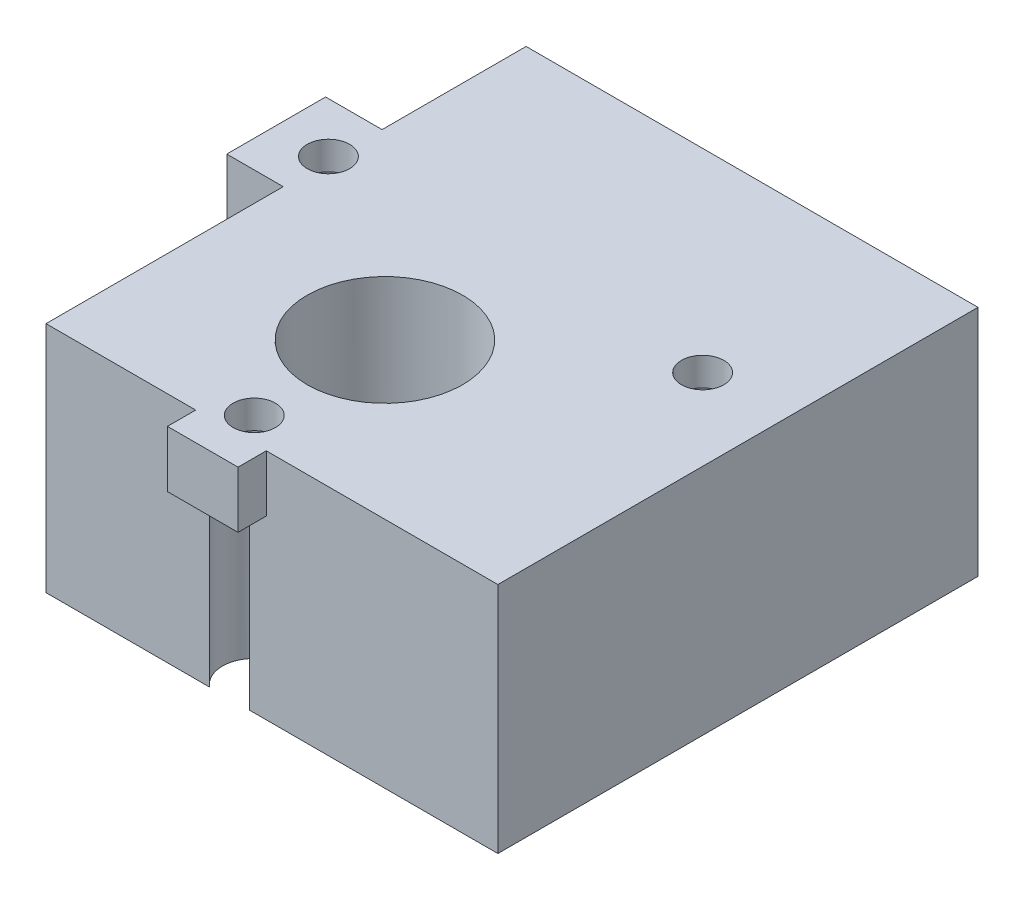
ISO-10303-21;
HEADER;
FILE_DESCRIPTION(('STEP AP214'),'2;1');
FILE_NAME('part.step','',(''),(''),'','','');
FILE_SCHEMA(('AUTOMOTIVE_DESIGN { 1 0 10303 214 1 1 1 1 }'));
ENDSEC;
DATA;
#1=APPLICATION_CONTEXT('core data for automotive mechanical design processes');
#2=APPLICATION_PROTOCOL_DEFINITION('international standard','automotive_design',2000,#1);
#3=PRODUCT_CONTEXT('',#1,'mechanical');
#4=PRODUCT('Part','Part','',(#3));
#5=PRODUCT_RELATED_PRODUCT_CATEGORY('part','',(#4));
#6=PRODUCT_DEFINITION_FORMATION('','',#4);
#7=PRODUCT_DEFINITION_CONTEXT('part definition',#1,'design');
#8=PRODUCT_DEFINITION('design','',#6,#7);
#9=PRODUCT_DEFINITION_SHAPE('','',#8);
#10=(LENGTH_UNIT() NAMED_UNIT(*) SI_UNIT(.MILLI.,.METRE.));
#11=(NAMED_UNIT(*) PLANE_ANGLE_UNIT() SI_UNIT($,.RADIAN.));
#12=(NAMED_UNIT(*) SI_UNIT($,.STERADIAN.) SOLID_ANGLE_UNIT());
#13=UNCERTAINTY_MEASURE_WITH_UNIT(LENGTH_MEASURE(1.E-05),#10,'distance_accuracy_value','');
#14=(GEOMETRIC_REPRESENTATION_CONTEXT(3) GLOBAL_UNCERTAINTY_ASSIGNED_CONTEXT((#13)) GLOBAL_UNIT_ASSIGNED_CONTEXT((#10,
#11,#12)) REPRESENTATION_CONTEXT('',''));
#15=CARTESIAN_POINT('',(0.,0.,0.));
#16=DIRECTION('',(0.,0.,1.));
#17=DIRECTION('',(1.,0.,0.));
#18=AXIS2_PLACEMENT_3D('',#15,#16,#17);
#19=CARTESIAN_POINT('',(-13.,13.5,-23.));
#20=DIRECTION('',(1.,0.,0.));
#21=DIRECTION('',(0.,0.,-1.));
#22=AXIS2_PLACEMENT_3D('',#19,#20,#21);
#23=PLANE('',#22);
#24=DIRECTION('',(0.,-1.,0.));
#25=VECTOR('',#24,1.);
#26=CARTESIAN_POINT('',(-13.,19.8639610306789,-11.4860679774998));
#27=LINE('',#26,#25);
#28=CARTESIAN_POINT('',(-13.,9.5,-11.4860679774998));
#29=VERTEX_POINT('',#28);
#30=CARTESIAN_POINT('',(-13.,-3.,-11.4860679774998));
#31=VERTEX_POINT('',#30);
#32=EDGE_CURVE('E519',#29,#31,#27,.T.);
#33=ORIENTED_EDGE('',*,*,#32,.F.);
#34=DIRECTION('',(0.,0.,-1.));
#35=VECTOR('',#34,1.);
#36=CARTESIAN_POINT('',(-13.,9.5,-5.8));
#37=LINE('',#36,#35);
#38=CARTESIAN_POINT('',(-13.,9.5,-12.8));
#39=VERTEX_POINT('',#38);
#40=EDGE_CURVE('E480',#29,#39,#37,.T.);
#41=ORIENTED_EDGE('',*,*,#40,.T.);
#42=DIRECTION('',(0.,1.,0.));
#43=VECTOR('',#42,1.);
#44=CARTESIAN_POINT('',(-13.,9.5,-12.8));
#45=LINE('',#44,#43);
#46=CARTESIAN_POINT('',(-13.,13.5,-12.8));
#47=VERTEX_POINT('',#46);
#48=EDGE_CURVE('E488',#39,#47,#45,.T.);
#49=ORIENTED_EDGE('',*,*,#48,.T.);
#50=DIRECTION('',(0.,0.,1.));
#51=VECTOR('',#50,1.);
#52=CARTESIAN_POINT('',(-13.,13.5,-23.));
#53=LINE('',#52,#51);
#54=CARTESIAN_POINT('',(-13.,13.5,-23.));
#55=VERTEX_POINT('',#54);
#56=EDGE_CURVE('E379',#55,#47,#53,.T.);
#57=ORIENTED_EDGE('',*,*,#56,.F.);
#58=DIRECTION('',(0.,-1.,0.));
#59=VECTOR('',#58,1.);
#60=CARTESIAN_POINT('',(-13.,13.5,-23.));
#61=LINE('',#60,#59);
#62=CARTESIAN_POINT('',(-13.,-3.,-23.));
#63=VERTEX_POINT('',#62);
#64=EDGE_CURVE('E392',#55,#63,#61,.T.);
#65=ORIENTED_EDGE('',*,*,#64,.T.);
#66=DIRECTION('',(0.,0.,1.));
#67=VECTOR('',#66,1.);
#68=CARTESIAN_POINT('',(-13.,-3.,-23.));
#69=LINE('',#68,#67);
#70=EDGE_CURVE('E344',#63,#31,#69,.T.);
#71=ORIENTED_EDGE('',*,*,#70,.T.);
#72=EDGE_LOOP('',(#33,#41,#49,#57,#65,#71));
#73=FACE_BOUND('',#72,.T.);
#74=ADVANCED_FACE('F169',(#73),#23,.F.);
#75=DIRECTION('',(0.,-1.,0.));
#76=VECTOR('',#75,1.);
#77=CARTESIAN_POINT('',(-13.,19.8639610306789,-7.01393202250021));
#78=LINE('',#77,#76);
#79=CARTESIAN_POINT('',(-13.,-3.,-7.01393202250021));
#80=VERTEX_POINT('',#79);
#81=CARTESIAN_POINT('',(-13.,9.5,-7.01393202250021));
#82=VERTEX_POINT('',#81);
#83=EDGE_CURVE('E190',#80,#82,#78,.F.);
#84=ORIENTED_EDGE('',*,*,#83,.F.);
#85=CARTESIAN_POINT('',(-13.,-3.,11.));
#86=VERTEX_POINT('',#85);
#87=EDGE_CURVE('E347',#80,#86,#69,.T.);
#88=ORIENTED_EDGE('',*,*,#87,.T.);
#89=DIRECTION('',(0.,-1.,0.));
#90=VECTOR('',#89,1.);
#91=CARTESIAN_POINT('',(-13.,13.5,11.));
#92=LINE('',#91,#90);
#93=CARTESIAN_POINT('',(-13.,13.5,11.));
#94=VERTEX_POINT('',#93);
#95=EDGE_CURVE('E398',#94,#86,#92,.T.);
#96=ORIENTED_EDGE('',*,*,#95,.F.);
#97=CARTESIAN_POINT('',(-13.,13.5,-5.8));
#98=VERTEX_POINT('',#97);
#99=EDGE_CURVE('E378',#98,#94,#53,.T.);
#100=ORIENTED_EDGE('',*,*,#99,.F.);
#101=DIRECTION('',(0.,1.,0.));
#102=VECTOR('',#101,1.);
#103=CARTESIAN_POINT('',(-13.,9.5,-5.8));
#104=LINE('',#103,#102);
#105=CARTESIAN_POINT('',(-13.,9.5,-5.8));
#106=VERTEX_POINT('',#105);
#107=EDGE_CURVE('E495',#106,#98,#104,.T.);
#108=ORIENTED_EDGE('',*,*,#107,.F.);
#109=EDGE_CURVE('E476',#106,#82,#37,.T.);
#110=ORIENTED_EDGE('',*,*,#109,.T.);
#111=EDGE_LOOP('',(#84,#88,#96,#100,#108,#110));
#112=FACE_BOUND('',#111,.T.);
#113=ADVANCED_FACE('F591',(#112),#23,.F.);
#114=CARTESIAN_POINT('',(-13.,13.5,11.));
#115=DIRECTION('',(0.,0.,-1.));
#116=DIRECTION('',(-1.,0.,0.));
#117=AXIS2_PLACEMENT_3D('',#114,#115,#116);
#118=PLANE('',#117);
#119=DIRECTION('',(0.,-1.,0.));
#120=VECTOR('',#119,1.);
#121=CARTESIAN_POINT('',(1.4142135623731,19.8639610306789,11.));
#122=LINE('',#121,#120);
#123=CARTESIAN_POINT('',(1.4142135623731,-3.,11.));
#124=VERTEX_POINT('',#123);
#125=CARTESIAN_POINT('',(1.4142135623731,9.5,11.));
#126=VERTEX_POINT('',#125);
#127=EDGE_CURVE('E183',#124,#126,#122,.F.);
#128=ORIENTED_EDGE('',*,*,#127,.F.);
#129=DIRECTION('',(1.,0.,0.));
#130=VECTOR('',#129,1.);
#131=CARTESIAN_POINT('',(-13.,-3.,11.));
#132=LINE('',#131,#130);
#133=CARTESIAN_POINT('',(19.,-3.,11.));
#134=VERTEX_POINT('',#133);
#135=EDGE_CURVE('E329',#124,#134,#132,.T.);
#136=ORIENTED_EDGE('',*,*,#135,.T.);
#137=DIRECTION('',(0.,-1.,0.));
#138=VECTOR('',#137,1.);
#139=CARTESIAN_POINT('',(19.,13.5,11.));
#140=LINE('',#139,#138);
#141=CARTESIAN_POINT('',(19.,13.5,11.));
#142=VERTEX_POINT('',#141);
#143=EDGE_CURVE('E396',#142,#134,#140,.T.);
#144=ORIENTED_EDGE('',*,*,#143,.F.);
#145=DIRECTION('',(1.,0.,0.));
#146=VECTOR('',#145,1.);
#147=CARTESIAN_POINT('',(-13.,13.5,11.));
#148=LINE('',#147,#146);
#149=CARTESIAN_POINT('',(2.60000000000028,13.5,11.));
#150=VERTEX_POINT('',#149);
#151=EDGE_CURVE('E382',#150,#142,#148,.T.);
#152=ORIENTED_EDGE('',*,*,#151,.F.);
#153=DIRECTION('',(0.,1.,0.));
#154=VECTOR('',#153,1.);
#155=CARTESIAN_POINT('',(2.60000000000028,9.5,11.));
#156=LINE('',#155,#154);
#157=CARTESIAN_POINT('',(2.60000000000028,9.5,11.));
#158=VERTEX_POINT('',#157);
#159=EDGE_CURVE('E454',#158,#150,#156,.T.);
#160=ORIENTED_EDGE('',*,*,#159,.F.);
#161=DIRECTION('',(-1.,0.,0.));
#162=VECTOR('',#161,1.);
#163=CARTESIAN_POINT('',(2.60000000000028,9.5,11.));
#164=LINE('',#163,#162);
#165=EDGE_CURVE('E333',#158,#126,#164,.T.);
#166=ORIENTED_EDGE('',*,*,#165,.T.);
#167=EDGE_LOOP('',(#128,#136,#144,#152,#160,#166));
#168=FACE_BOUND('',#167,.T.);
#169=ADVANCED_FACE('F327',(#168),#118,.F.);
#170=DIRECTION('',(0.,-1.,0.));
#171=VECTOR('',#170,1.);
#172=CARTESIAN_POINT('',(-1.41421356237308,19.8639610306789,11.));
#173=LINE('',#172,#171);
#174=CARTESIAN_POINT('',(-1.41421356237308,9.5,11.));
#175=VERTEX_POINT('',#174);
#176=CARTESIAN_POINT('',(-1.41421356237308,-3.,11.));
#177=VERTEX_POINT('',#176);
#178=EDGE_CURVE('E317',#175,#177,#173,.T.);
#179=ORIENTED_EDGE('',*,*,#178,.F.);
#180=CARTESIAN_POINT('',(-2.39999999999972,9.5,11.));
#181=VERTEX_POINT('',#180);
#182=EDGE_CURVE('E468',#175,#181,#164,.T.);
#183=ORIENTED_EDGE('',*,*,#182,.T.);
#184=DIRECTION('',(0.,1.,0.));
#185=VECTOR('',#184,1.);
#186=CARTESIAN_POINT('',(-2.39999999999972,9.5,11.));
#187=LINE('',#186,#185);
#188=CARTESIAN_POINT('',(-2.39999999999972,13.5,11.));
#189=VERTEX_POINT('',#188);
#190=EDGE_CURVE('E451',#181,#189,#187,.T.);
#191=ORIENTED_EDGE('',*,*,#190,.T.);
#192=EDGE_CURVE('E383',#94,#189,#148,.T.);
#193=ORIENTED_EDGE('',*,*,#192,.F.);
#194=ORIENTED_EDGE('',*,*,#95,.T.);
#195=EDGE_CURVE('E343',#86,#177,#132,.T.);
#196=ORIENTED_EDGE('',*,*,#195,.T.);
#197=EDGE_LOOP('',(#179,#183,#191,#193,#194,#196));
#198=FACE_BOUND('',#197,.T.);
#199=ADVANCED_FACE('F668',(#198),#118,.F.);
#200=CARTESIAN_POINT('',(-3.48913043478261,-3.,-11.4815490596467));
#201=DIRECTION('',(0.,1.,0.));
#202=DIRECTION('',(0.,0.,1.));
#203=AXIS2_PLACEMENT_3D('',#200,#201,#202);
#204=CYLINDRICAL_SURFACE('',#203,8.5);
#205=DIRECTION('',(0.,-1.,0.));
#206=VECTOR('',#205,1.);
#207=CARTESIAN_POINT('',(-11.2996587041269,4.25,-8.12809589107955));
#208=LINE('',#207,#206);
#209=CARTESIAN_POINT('',(-11.2996587041269,0.,-8.12809589107955));
#210=VERTEX_POINT('',#209);
#211=CARTESIAN_POINT('',(-11.2996587041269,-3.,-8.12809589107955));
#212=VERTEX_POINT('',#211);
#213=EDGE_CURVE('E513',#210,#212,#208,.T.);
#214=ORIENTED_EDGE('',*,*,#213,.F.);
#215=CARTESIAN_POINT('',(-3.48913043478261,0.,-11.4815490596467));
#216=DIRECTION('',(0.,1.,0.));
#217=DIRECTION('',(0.,0.,1.));
#218=AXIS2_PLACEMENT_3D('',#215,#216,#217);
#219=CIRCLE('',#218,8.5);
#220=CARTESIAN_POINT('',(-4.57596509446919,0.,-3.05131831413895));
#221=VERTEX_POINT('',#220);
#222=EDGE_CURVE('E425',#210,#221,#219,.T.);
#223=ORIENTED_EDGE('',*,*,#222,.T.);
#224=DIRECTION('',(0.,1.,0.));
#225=VECTOR('',#224,1.);
#226=CARTESIAN_POINT('',(-4.57596509446919,-1.5,-3.05131831413895));
#227=LINE('',#226,#225);
#228=CARTESIAN_POINT('',(-4.57596509446919,-3.,-3.05131831413895));
#229=VERTEX_POINT('',#228);
#230=EDGE_CURVE('E354',#221,#229,#227,.F.);
#231=ORIENTED_EDGE('',*,*,#230,.T.);
#232=CARTESIAN_POINT('',(-3.48913043478261,-3.,-11.4815490596467));
#233=DIRECTION('',(0.,1.,0.));
#234=DIRECTION('',(0.,0.,1.));
#235=AXIS2_PLACEMENT_3D('',#232,#233,#234);
#236=CIRCLE('',#235,8.5);
#237=EDGE_CURVE('E422',#212,#229,#236,.T.);
#238=ORIENTED_EDGE('',*,*,#237,.F.);
#239=EDGE_LOOP('',(#214,#223,#231,#238));
#240=FACE_BOUND('',#239,.T.);
#241=ADVANCED_FACE('F632',(#240),#204,.F.);
#242=DIRECTION('',(0.,-1.,0.));
#243=VECTOR('',#242,1.);
#244=CARTESIAN_POINT('',(-11.9809154609284,4.25,-11.1079355297453));
#245=LINE('',#244,#243);
#246=CARTESIAN_POINT('',(-11.9809154609284,-3.,-11.1079355297453));
#247=VERTEX_POINT('',#246);
#248=CARTESIAN_POINT('',(-11.9809154609284,0.,-11.1079355297453));
#249=VERTEX_POINT('',#248);
#250=EDGE_CURVE('E517',#247,#249,#245,.F.);
#251=ORIENTED_EDGE('',*,*,#250,.F.);
#252=CARTESIAN_POINT('',(2.10449770316484,-3.,-5.0814456031108));
#253=VERTEX_POINT('',#252);
#254=EDGE_CURVE('E420',#253,#247,#236,.T.);
#255=ORIENTED_EDGE('',*,*,#254,.F.);
#256=DIRECTION('',(0.,1.,0.));
#257=VECTOR('',#256,1.);
#258=CARTESIAN_POINT('',(2.10449770316484,-1.5,-5.08144560311081));
#259=LINE('',#258,#257);
#260=CARTESIAN_POINT('',(2.10449770316484,0.,-5.0814456031108));
#261=VERTEX_POINT('',#260);
#262=EDGE_CURVE('E357',#253,#261,#259,.T.);
#263=ORIENTED_EDGE('',*,*,#262,.T.);
#264=EDGE_CURVE('E423',#261,#249,#219,.T.);
#265=ORIENTED_EDGE('',*,*,#264,.T.);
#266=EDGE_LOOP('',(#251,#255,#263,#265));
#267=FACE_BOUND('',#266,.T.);
#268=ADVANCED_FACE('F620',(#267),#204,.F.);
#269=CARTESIAN_POINT('',(0.,0.,0.));
#270=DIRECTION('',(0.,1.,0.));
#271=DIRECTION('',(0.,0.,1.));
#272=AXIS2_PLACEMENT_3D('',#269,#270,#271);
#273=PLANE('',#272);
#274=CARTESIAN_POINT('',(4.98501881873766,0.,-0.386765273559278));
#275=DIRECTION('',(0.,1.,0.));
#276=DIRECTION('',(0.,0.,1.));
#277=AXIS2_PLACEMENT_3D('',#274,#275,#276);
#278=CIRCLE('',#277,1.2);
#279=CARTESIAN_POINT('',(5.45289806149909,0.,0.718263691759281));
#280=VERTEX_POINT('',#279);
#281=CARTESIAN_POINT('',(5.27685644395189,0.,-1.55073726656827));
#282=VERTEX_POINT('',#281);
#283=EDGE_CURVE('E442',#280,#282,#278,.T.);
#284=ORIENTED_EDGE('',*,*,#283,.F.);
#285=CARTESIAN_POINT('',(0.,0.,0.));
#286=DIRECTION('',(0.,1.,0.));
#287=DIRECTION('',(0.,0.,1.));
#288=AXIS2_PLACEMENT_3D('',#285,#286,#287);
#289=CIRCLE('',#288,5.50000000000002);
#290=EDGE_CURVE('E374',#280,#282,#289,.T.);
#291=ORIENTED_EDGE('',*,*,#290,.T.);
#292=EDGE_LOOP('',(#284,#291));
#293=FACE_BOUND('',#292,.T.);
#294=ADVANCED_FACE('F638',(#293),#273,.F.);
#295=CARTESIAN_POINT('',(-13.2499999999999,0.,-9.25000000000001));
#296=DIRECTION('',(0.,1.,0.));
#297=DIRECTION('',(0.,0.,1.));
#298=AXIS2_PLACEMENT_3D('',#295,#296,#297);
#299=CIRCLE('',#298,2.25);
#300=EDGE_CURVE('E515',#249,#210,#299,.F.);
#301=ORIENTED_EDGE('',*,*,#300,.F.);
#302=ORIENTED_EDGE('',*,*,#264,.F.);
#303=EDGE_CURVE('E369',#261,#221,#289,.T.);
#304=ORIENTED_EDGE('',*,*,#303,.T.);
#305=ORIENTED_EDGE('',*,*,#222,.F.);
#306=EDGE_LOOP('',(#301,#302,#304,#305));
#307=FACE_BOUND('',#306,.T.);
#308=CARTESIAN_POINT('',(-3.48913043478261,0.,-11.4815490596467));
#309=DIRECTION('',(0.,1.,0.));
#310=DIRECTION('',(0.,0.,1.));
#311=AXIS2_PLACEMENT_3D('',#308,#309,#310);
#312=CIRCLE('',#311,1.2);
#313=CARTESIAN_POINT('',(-3.48913043478261,0.,-10.2815490596467));
#314=VERTEX_POINT('',#313);
#315=EDGE_CURVE('E373',#314,#314,#312,.T.);
#316=ORIENTED_EDGE('',*,*,#315,.T.);
#317=EDGE_LOOP('',(#316));
#318=FACE_BOUND('',#317,.T.);
#319=ADVANCED_FACE('F629',(#307,#318),#273,.F.);
#320=CARTESIAN_POINT('',(-3.48913043478261,13.5,-11.4815490596467));
#321=DIRECTION('',(0.,-1.,0.));
#322=DIRECTION('',(0.,0.,-1.));
#323=AXIS2_PLACEMENT_3D('',#320,#321,#322);
#324=CYLINDRICAL_SURFACE('',#323,1.2);
#325=ORIENTED_EDGE('',*,*,#315,.F.);
#326=EDGE_LOOP('',(#325));
#327=FACE_BOUND('',#326,.T.);
#328=CARTESIAN_POINT('',(-3.48913043478261,3.,-11.4815490596467));
#329=DIRECTION('',(0.,1.,0.));
#330=DIRECTION('',(0.,0.,1.));
#331=AXIS2_PLACEMENT_3D('',#328,#329,#330);
#332=CIRCLE('',#331,1.2);
#333=CARTESIAN_POINT('',(-3.48913043478261,3.,-10.2815490596467));
#334=VERTEX_POINT('',#333);
#335=EDGE_CURVE('E366',#334,#334,#332,.F.);
#336=ORIENTED_EDGE('',*,*,#335,.F.);
#337=EDGE_LOOP('',(#336));
#338=FACE_BOUND('',#337,.T.);
#339=ADVANCED_FACE('F646',(#327,#338),#324,.F.);
#340=CARTESIAN_POINT('',(0.,13.5,0.));
#341=DIRECTION('',(0.,1.,0.));
#342=DIRECTION('',(0.,0.,1.));
#343=AXIS2_PLACEMENT_3D('',#340,#341,#342);
#344=PLANE('',#343);
#345=CARTESIAN_POINT('',(13.2499999999999,13.5,-9.25));
#346=DIRECTION('',(0.,1.,0.));
#347=DIRECTION('',(0.,0.,1.));
#348=AXIS2_PLACEMENT_3D('',#345,#346,#347);
#349=CIRCLE('',#348,1.5);
#350=CARTESIAN_POINT('',(13.2499999999999,13.5,-7.75));
#351=VERTEX_POINT('',#350);
#352=EDGE_CURVE('E498',#351,#351,#349,.T.);
#353=ORIENTED_EDGE('',*,*,#352,.F.);
#354=EDGE_LOOP('',(#353));
#355=FACE_BOUND('',#354,.T.);
#356=CARTESIAN_POINT('',(-13.2499999999999,13.5,-9.25000000000001));
#357=DIRECTION('',(0.,1.,0.));
#358=DIRECTION('',(0.,0.,1.));
#359=AXIS2_PLACEMENT_3D('',#356,#357,#358);
#360=CIRCLE('',#359,1.5);
#361=CARTESIAN_POINT('',(-13.2499999999999,13.5,-7.75));
#362=VERTEX_POINT('',#361);
#363=EDGE_CURVE('E507',#362,#362,#360,.T.);
#364=ORIENTED_EDGE('',*,*,#363,.F.);
#365=EDGE_LOOP('',(#364));
#366=FACE_BOUND('',#365,.T.);
#367=CARTESIAN_POINT('',(0.,13.5,9.24999999999999));
#368=DIRECTION('',(0.,1.,0.));
#369=DIRECTION('',(0.,0.,1.));
#370=AXIS2_PLACEMENT_3D('',#367,#368,#369);
#371=CIRCLE('',#370,1.5);
#372=CARTESIAN_POINT('',(0.,13.5,10.75));
#373=VERTEX_POINT('',#372);
#374=EDGE_CURVE('E334',#373,#373,#371,.T.);
#375=ORIENTED_EDGE('',*,*,#374,.F.);
#376=EDGE_LOOP('',(#375));
#377=FACE_BOUND('',#376,.T.);
#378=ORIENTED_EDGE('',*,*,#56,.T.);
#379=DIRECTION('',(-1.,0.,0.));
#380=VECTOR('',#379,1.);
#381=CARTESIAN_POINT('',(-13.,13.5,-12.8));
#382=LINE('',#381,#380);
#383=CARTESIAN_POINT('',(-17.,13.5,-12.8));
#384=VERTEX_POINT('',#383);
#385=EDGE_CURVE('E466',#47,#384,#382,.T.);
#386=ORIENTED_EDGE('',*,*,#385,.T.);
#387=DIRECTION('',(0.,0.,-1.));
#388=VECTOR('',#387,1.);
#389=CARTESIAN_POINT('',(-17.,13.5,-5.8));
#390=LINE('',#389,#388);
#391=CARTESIAN_POINT('',(-17.,13.5,-5.8));
#392=VERTEX_POINT('',#391);
#393=EDGE_CURVE('E491',#392,#384,#390,.T.);
#394=ORIENTED_EDGE('',*,*,#393,.F.);
#395=DIRECTION('',(-1.,0.,0.));
#396=VECTOR('',#395,1.);
#397=CARTESIAN_POINT('',(-13.,13.5,-5.8));
#398=LINE('',#397,#396);
#399=EDGE_CURVE('E479',#98,#392,#398,.T.);
#400=ORIENTED_EDGE('',*,*,#399,.F.);
#401=ORIENTED_EDGE('',*,*,#99,.T.);
#402=ORIENTED_EDGE('',*,*,#192,.T.);
#403=DIRECTION('',(0.,0.,1.));
#404=VECTOR('',#403,1.);
#405=CARTESIAN_POINT('',(-2.39999999999972,13.5,11.));
#406=LINE('',#405,#404);
#407=CARTESIAN_POINT('',(-2.39999999999972,13.5,13.));
#408=VERTEX_POINT('',#407);
#409=EDGE_CURVE('E456',#189,#408,#406,.T.);
#410=ORIENTED_EDGE('',*,*,#409,.T.);
#411=DIRECTION('',(-1.,0.,0.));
#412=VECTOR('',#411,1.);
#413=CARTESIAN_POINT('',(2.60000000000028,13.5,13.));
#414=LINE('',#413,#412);
#415=CARTESIAN_POINT('',(2.60000000000028,13.5,13.));
#416=VERTEX_POINT('',#415);
#417=EDGE_CURVE('E460',#416,#408,#414,.T.);
#418=ORIENTED_EDGE('',*,*,#417,.F.);
#419=DIRECTION('',(0.,0.,1.));
#420=VECTOR('',#419,1.);
#421=CARTESIAN_POINT('',(2.60000000000028,13.5,11.));
#422=LINE('',#421,#420);
#423=EDGE_CURVE('E463',#150,#416,#422,.T.);
#424=ORIENTED_EDGE('',*,*,#423,.F.);
#425=ORIENTED_EDGE('',*,*,#151,.T.);
#426=DIRECTION('',(0.,0.,1.));
#427=VECTOR('',#426,1.);
#428=CARTESIAN_POINT('',(19.,13.5,-23.));
#429=LINE('',#428,#427);
#430=CARTESIAN_POINT('',(19.,13.5,-23.));
#431=VERTEX_POINT('',#430);
#432=EDGE_CURVE('E386',#431,#142,#429,.T.);
#433=ORIENTED_EDGE('',*,*,#432,.F.);
#434=DIRECTION('',(1.,0.,0.));
#435=VECTOR('',#434,1.);
#436=CARTESIAN_POINT('',(-13.,13.5,-23.));
#437=LINE('',#436,#435);
#438=EDGE_CURVE('E389',#55,#431,#437,.T.);
#439=ORIENTED_EDGE('',*,*,#438,.F.);
#440=EDGE_LOOP('',(#378,#386,#394,#400,#401,#402,#410,#418,#424,#425,#433,#439));
#441=FACE_BOUND('',#440,.T.);
#442=CARTESIAN_POINT('',(0.,13.5,0.));
#443=DIRECTION('',(0.,1.,0.));
#444=DIRECTION('',(0.,0.,1.));
#445=AXIS2_PLACEMENT_3D('',#442,#443,#444);
#446=CIRCLE('',#445,5.50000000000002);
#447=CARTESIAN_POINT('',(0.,13.5,5.50000000000002));
#448=VERTEX_POINT('',#447);
#449=EDGE_CURVE('E370',#448,#448,#446,.T.);
#450=ORIENTED_EDGE('',*,*,#449,.F.);
#451=EDGE_LOOP('',(#450));
#452=FACE_BOUND('',#451,.T.);
#453=ADVANCED_FACE('F611',(#355,#366,#377,#441,#452),#344,.T.);
#454=CARTESIAN_POINT('',(19.,13.5,-23.));
#455=DIRECTION('',(1.,0.,0.));
#456=DIRECTION('',(0.,0.,-1.));
#457=AXIS2_PLACEMENT_3D('',#454,#455,#456);
#458=PLANE('',#457);
#459=ORIENTED_EDGE('',*,*,#143,.T.);
#460=DIRECTION('',(0.,0.,1.));
#461=VECTOR('',#460,1.);
#462=CARTESIAN_POINT('',(19.,-3.,-23.));
#463=LINE('',#462,#461);
#464=CARTESIAN_POINT('',(19.,-3.,-23.));
#465=VERTEX_POINT('',#464);
#466=EDGE_CURVE('E342',#465,#134,#463,.T.);
#467=ORIENTED_EDGE('',*,*,#466,.F.);
#468=DIRECTION('',(0.,-1.,0.));
#469=VECTOR('',#468,1.);
#470=CARTESIAN_POINT('',(19.,13.5,-23.));
#471=LINE('',#470,#469);
#472=EDGE_CURVE('E394',#431,#465,#471,.T.);
#473=ORIENTED_EDGE('',*,*,#472,.F.);
#474=ORIENTED_EDGE('',*,*,#432,.T.);
#475=EDGE_LOOP('',(#459,#467,#473,#474));
#476=FACE_BOUND('',#475,.T.);
#477=ADVANCED_FACE('F679',(#476),#458,.T.);
#478=CARTESIAN_POINT('',(-13.,13.5,-23.));
#479=DIRECTION('',(0.,0.,-1.));
#480=DIRECTION('',(-1.,0.,0.));
#481=AXIS2_PLACEMENT_3D('',#478,#479,#480);
#482=PLANE('',#481);
#483=ORIENTED_EDGE('',*,*,#472,.T.);
#484=DIRECTION('',(1.,0.,0.));
#485=VECTOR('',#484,1.);
#486=CARTESIAN_POINT('',(-13.,-3.,-23.));
#487=LINE('',#486,#485);
#488=EDGE_CURVE('E352',#63,#465,#487,.T.);
#489=ORIENTED_EDGE('',*,*,#488,.F.);
#490=ORIENTED_EDGE('',*,*,#64,.F.);
#491=ORIENTED_EDGE('',*,*,#438,.T.);
#492=EDGE_LOOP('',(#483,#489,#490,#491));
#493=FACE_BOUND('',#492,.T.);
#494=ADVANCED_FACE('F616',(#493),#482,.T.);
#495=CARTESIAN_POINT('',(0.,13.5,0.));
#496=DIRECTION('',(0.,-1.,0.));
#497=DIRECTION('',(0.,0.,-1.));
#498=AXIS2_PLACEMENT_3D('',#495,#496,#497);
#499=CYLINDRICAL_SURFACE('',#498,5.50000000000002);
#500=ORIENTED_EDGE('',*,*,#449,.T.);
#501=EDGE_LOOP('',(#500));
#502=FACE_BOUND('',#501,.T.);
#503=ORIENTED_EDGE('',*,*,#290,.F.);
#504=DIRECTION('',(0.,1.,0.));
#505=VECTOR('',#504,1.);
#506=CARTESIAN_POINT('',(5.45289806149909,-1.5,0.718263691759279));
#507=LINE('',#506,#505);
#508=CARTESIAN_POINT('',(5.45289806149909,-3.,0.718263691759278));
#509=VERTEX_POINT('',#508);
#510=EDGE_CURVE('E360',#280,#509,#507,.F.);
#511=ORIENTED_EDGE('',*,*,#510,.T.);
#512=CARTESIAN_POINT('',(0.,-3.,0.));
#513=DIRECTION('',(0.,1.,0.));
#514=DIRECTION('',(0.,0.,1.));
#515=AXIS2_PLACEMENT_3D('',#512,#513,#514);
#516=CIRCLE('',#515,5.50000000000002);
#517=EDGE_CURVE('E433',#229,#509,#516,.T.);
#518=ORIENTED_EDGE('',*,*,#517,.F.);
#519=ORIENTED_EDGE('',*,*,#230,.F.);
#520=ORIENTED_EDGE('',*,*,#303,.F.);
#521=ORIENTED_EDGE('',*,*,#262,.F.);
#522=CARTESIAN_POINT('',(5.27685644395189,-3.,-1.55073726656827));
#523=VERTEX_POINT('',#522);
#524=EDGE_CURVE('E437',#523,#253,#516,.T.);
#525=ORIENTED_EDGE('',*,*,#524,.F.);
#526=DIRECTION('',(0.,1.,0.));
#527=VECTOR('',#526,1.);
#528=CARTESIAN_POINT('',(5.27685644395189,-1.5,-1.55073726656827));
#529=LINE('',#528,#527);
#530=EDGE_CURVE('E363',#523,#282,#529,.T.);
#531=ORIENTED_EDGE('',*,*,#530,.T.);
#532=EDGE_LOOP('',(#503,#511,#518,#519,#520,#521,#525,#531));
#533=FACE_BOUND('',#532,.T.);
#534=ADVANCED_FACE('F626',(#502,#533),#499,.F.);
#535=CARTESIAN_POINT('',(0.,3.,0.));
#536=DIRECTION('',(0.,1.,0.));
#537=DIRECTION('',(0.,0.,1.));
#538=AXIS2_PLACEMENT_3D('',#535,#536,#537);
#539=PLANE('',#538);
#540=ORIENTED_EDGE('',*,*,#335,.T.);
#541=EDGE_LOOP('',(#540));
#542=FACE_BOUND('',#541,.T.);
#543=ADVANCED_FACE('F566',(#542),#539,.F.);
#544=CARTESIAN_POINT('',(0.,-3.,0.));
#545=DIRECTION('',(0.,1.,0.));
#546=DIRECTION('',(0.,0.,1.));
#547=AXIS2_PLACEMENT_3D('',#544,#545,#546);
#548=PLANE('',#547);
#549=CARTESIAN_POINT('',(-9.99999999999996,-3.,8.));
#550=DIRECTION('',(0.,-1.,0.));
#551=DIRECTION('',(0.,0.,-1.));
#552=AXIS2_PLACEMENT_3D('',#549,#550,#551);
#553=CIRCLE('',#552,0.75);
#554=CARTESIAN_POINT('',(-9.99999999999996,-3.,7.25));
#555=VERTEX_POINT('',#554);
#556=EDGE_CURVE('E548',#555,#555,#553,.T.);
#557=ORIENTED_EDGE('',*,*,#556,.F.);
#558=EDGE_LOOP('',(#557));
#559=FACE_BOUND('',#558,.T.);
#560=CARTESIAN_POINT('',(17.,-3.,-21.));
#561=DIRECTION('',(0.,-1.,0.));
#562=DIRECTION('',(0.,0.,-1.));
#563=AXIS2_PLACEMENT_3D('',#560,#561,#562);
#564=CIRCLE('',#563,0.750000000000002);
#565=CARTESIAN_POINT('',(17.,-3.,-21.75));
#566=VERTEX_POINT('',#565);
#567=EDGE_CURVE('E542',#566,#566,#564,.T.);
#568=ORIENTED_EDGE('',*,*,#567,.F.);
#569=EDGE_LOOP('',(#568));
#570=FACE_BOUND('',#569,.T.);
#571=CARTESIAN_POINT('',(16.,-3.,8.));
#572=DIRECTION('',(0.,-1.,0.));
#573=DIRECTION('',(0.,0.,-1.));
#574=AXIS2_PLACEMENT_3D('',#571,#572,#573);
#575=CIRCLE('',#574,0.750000000000002);
#576=CARTESIAN_POINT('',(16.,-3.,7.25));
#577=VERTEX_POINT('',#576);
#578=EDGE_CURVE('E536',#577,#577,#575,.T.);
#579=ORIENTED_EDGE('',*,*,#578,.F.);
#580=EDGE_LOOP('',(#579));
#581=FACE_BOUND('',#580,.T.);
#582=CARTESIAN_POINT('',(-13.2499999999999,-3.,-9.25000000000001));
#583=DIRECTION('',(0.,1.,0.));
#584=DIRECTION('',(0.,0.,1.));
#585=AXIS2_PLACEMENT_3D('',#582,#583,#584);
#586=CIRCLE('',#585,2.25);
#587=EDGE_CURVE('E322',#247,#31,#586,.T.);
#588=ORIENTED_EDGE('',*,*,#587,.T.);
#589=ORIENTED_EDGE('',*,*,#70,.F.);
#590=ORIENTED_EDGE('',*,*,#488,.T.);
#591=ORIENTED_EDGE('',*,*,#466,.T.);
#592=ORIENTED_EDGE('',*,*,#135,.F.);
#593=CARTESIAN_POINT('',(0.,-3.,9.24999999999999));
#594=DIRECTION('',(0.,1.,0.));
#595=DIRECTION('',(0.,0.,1.));
#596=AXIS2_PLACEMENT_3D('',#593,#594,#595);
#597=CIRCLE('',#596,2.25);
#598=EDGE_CURVE('E314',#124,#177,#597,.T.);
#599=ORIENTED_EDGE('',*,*,#598,.T.);
#600=ORIENTED_EDGE('',*,*,#195,.F.);
#601=ORIENTED_EDGE('',*,*,#87,.F.);
#602=EDGE_CURVE('E533',#80,#212,#586,.T.);
#603=ORIENTED_EDGE('',*,*,#602,.T.);
#604=ORIENTED_EDGE('',*,*,#237,.T.);
#605=ORIENTED_EDGE('',*,*,#517,.T.);
#606=CARTESIAN_POINT('',(4.98501881873766,-3.,-0.386765273559278));
#607=DIRECTION('',(0.,1.,0.));
#608=DIRECTION('',(0.,0.,1.));
#609=AXIS2_PLACEMENT_3D('',#606,#607,#608);
#610=CIRCLE('',#609,1.2);
#611=EDGE_CURVE('E440',#509,#523,#610,.T.);
#612=ORIENTED_EDGE('',*,*,#611,.T.);
#613=ORIENTED_EDGE('',*,*,#524,.T.);
#614=ORIENTED_EDGE('',*,*,#254,.T.);
#615=EDGE_LOOP('',(#588,#589,#590,#591,#592,#599,#600,#601,#603,#604,#605,#612,#613,#614));
#616=FACE_BOUND('',#615,.T.);
#617=CARTESIAN_POINT('',(13.2499999999999,-3.,-9.25));
#618=DIRECTION('',(0.,1.,0.));
#619=DIRECTION('',(0.,0.,1.));
#620=AXIS2_PLACEMENT_3D('',#617,#618,#619);
#621=CIRCLE('',#620,2.25);
#622=CARTESIAN_POINT('',(13.2499999999999,-3.,-7.));
#623=VERTEX_POINT('',#622);
#624=EDGE_CURVE('E522',#623,#623,#621,.T.);
#625=ORIENTED_EDGE('',*,*,#624,.T.);
#626=EDGE_LOOP('',(#625));
#627=FACE_BOUND('',#626,.T.);
#628=CARTESIAN_POINT('',(8.01086956521739,-3.,-11.4815490596467));
#629=DIRECTION('',(0.,1.,0.));
#630=DIRECTION('',(0.,0.,1.));
#631=AXIS2_PLACEMENT_3D('',#628,#629,#630);
#632=CIRCLE('',#631,1.2);
#633=CARTESIAN_POINT('',(8.01086956521739,-3.,-10.2815490596467));
#634=VERTEX_POINT('',#633);
#635=EDGE_CURVE('E418',#634,#634,#632,.T.);
#636=ORIENTED_EDGE('',*,*,#635,.T.);
#637=EDGE_LOOP('',(#636));
#638=FACE_BOUND('',#637,.T.);
#639=ADVANCED_FACE('F338',(#559,#570,#581,#616,#627,#638),#548,.F.);
#640=CARTESIAN_POINT('',(8.01086956521739,-3.,-11.4815490596467));
#641=DIRECTION('',(0.,1.,0.));
#642=DIRECTION('',(0.,0.,1.));
#643=AXIS2_PLACEMENT_3D('',#640,#641,#642);
#644=CYLINDRICAL_SURFACE('',#643,1.2);
#645=ORIENTED_EDGE('',*,*,#635,.F.);
#646=EDGE_LOOP('',(#645));
#647=FACE_BOUND('',#646,.T.);
#648=CARTESIAN_POINT('',(8.01086956521739,0.,-11.4815490596467));
#649=DIRECTION('',(0.,1.,0.));
#650=DIRECTION('',(0.,0.,1.));
#651=AXIS2_PLACEMENT_3D('',#648,#649,#650);
#652=CIRCLE('',#651,1.2);
#653=CARTESIAN_POINT('',(8.01086956521739,0.,-10.2815490596467));
#654=VERTEX_POINT('',#653);
#655=EDGE_CURVE('E401',#654,#654,#652,.T.);
#656=ORIENTED_EDGE('',*,*,#655,.T.);
#657=EDGE_LOOP('',(#656));
#658=FACE_BOUND('',#657,.T.);
#659=ADVANCED_FACE('F565',(#647,#658),#644,.F.);
#660=CARTESIAN_POINT('',(4.98501881873766,-3.,-0.386765273559278));
#661=DIRECTION('',(0.,1.,0.));
#662=DIRECTION('',(0.,0.,1.));
#663=AXIS2_PLACEMENT_3D('',#660,#661,#662);
#664=CYLINDRICAL_SURFACE('',#663,1.2);
#665=ORIENTED_EDGE('',*,*,#611,.F.);
#666=ORIENTED_EDGE('',*,*,#510,.F.);
#667=ORIENTED_EDGE('',*,*,#283,.T.);
#668=ORIENTED_EDGE('',*,*,#530,.F.);
#669=EDGE_LOOP('',(#665,#666,#667,#668));
#670=FACE_BOUND('',#669,.T.);
#671=ADVANCED_FACE('F636',(#670),#664,.F.);
#672=ORIENTED_EDGE('',*,*,#655,.F.);
#673=EDGE_LOOP('',(#672));
#674=FACE_BOUND('',#673,.T.);
#675=ADVANCED_FACE('F641',(#674),#273,.F.);
#676=CARTESIAN_POINT('',(2.60000000000028,9.5,11.));
#677=DIRECTION('',(-1.,0.,0.));
#678=DIRECTION('',(0.,0.,1.));
#679=AXIS2_PLACEMENT_3D('',#676,#677,#678);
#680=PLANE('',#679);
#681=ORIENTED_EDGE('',*,*,#423,.T.);
#682=DIRECTION('',(0.,1.,0.));
#683=VECTOR('',#682,1.);
#684=CARTESIAN_POINT('',(2.60000000000028,9.5,13.));
#685=LINE('',#684,#683);
#686=CARTESIAN_POINT('',(2.60000000000028,9.5,13.));
#687=VERTEX_POINT('',#686);
#688=EDGE_CURVE('E445',#687,#416,#685,.T.);
#689=ORIENTED_EDGE('',*,*,#688,.F.);
#690=DIRECTION('',(0.,0.,1.));
#691=VECTOR('',#690,1.);
#692=CARTESIAN_POINT('',(2.60000000000028,9.5,11.));
#693=LINE('',#692,#691);
#694=EDGE_CURVE('E459',#158,#687,#693,.T.);
#695=ORIENTED_EDGE('',*,*,#694,.F.);
#696=ORIENTED_EDGE('',*,*,#159,.T.);
#697=EDGE_LOOP('',(#681,#689,#695,#696));
#698=FACE_BOUND('',#697,.T.);
#699=ADVANCED_FACE('F651',(#698),#680,.F.);
#700=CARTESIAN_POINT('',(2.60000000000028,9.5,13.));
#701=DIRECTION('',(0.,0.,-1.));
#702=DIRECTION('',(-1.,0.,0.));
#703=AXIS2_PLACEMENT_3D('',#700,#701,#702);
#704=PLANE('',#703);
#705=ORIENTED_EDGE('',*,*,#417,.T.);
#706=DIRECTION('',(0.,1.,0.));
#707=VECTOR('',#706,1.);
#708=CARTESIAN_POINT('',(-2.39999999999972,9.5,13.));
#709=LINE('',#708,#707);
#710=CARTESIAN_POINT('',(-2.39999999999972,9.5,13.));
#711=VERTEX_POINT('',#710);
#712=EDGE_CURVE('E449',#711,#408,#709,.T.);
#713=ORIENTED_EDGE('',*,*,#712,.F.);
#714=DIRECTION('',(-1.,0.,0.));
#715=VECTOR('',#714,1.);
#716=CARTESIAN_POINT('',(2.60000000000028,9.5,13.));
#717=LINE('',#716,#715);
#718=EDGE_CURVE('E472',#687,#711,#717,.T.);
#719=ORIENTED_EDGE('',*,*,#718,.F.);
#720=ORIENTED_EDGE('',*,*,#688,.T.);
#721=EDGE_LOOP('',(#705,#713,#719,#720));
#722=FACE_BOUND('',#721,.T.);
#723=ADVANCED_FACE('F657',(#722),#704,.F.);
#724=CARTESIAN_POINT('',(-2.39999999999972,9.5,11.));
#725=DIRECTION('',(-1.,0.,0.));
#726=DIRECTION('',(0.,0.,1.));
#727=AXIS2_PLACEMENT_3D('',#724,#725,#726);
#728=PLANE('',#727);
#729=ORIENTED_EDGE('',*,*,#409,.F.);
#730=ORIENTED_EDGE('',*,*,#190,.F.);
#731=DIRECTION('',(0.,0.,1.));
#732=VECTOR('',#731,1.);
#733=CARTESIAN_POINT('',(-2.39999999999972,9.5,11.));
#734=LINE('',#733,#732);
#735=EDGE_CURVE('E469',#181,#711,#734,.T.);
#736=ORIENTED_EDGE('',*,*,#735,.T.);
#737=ORIENTED_EDGE('',*,*,#712,.T.);
#738=EDGE_LOOP('',(#729,#730,#736,#737));
#739=FACE_BOUND('',#738,.T.);
#740=ADVANCED_FACE('F723',(#739),#728,.T.);
#741=CARTESIAN_POINT('',(0.,9.5,0.));
#742=DIRECTION('',(0.,-1.,0.));
#743=DIRECTION('',(0.,0.,-1.));
#744=AXIS2_PLACEMENT_3D('',#741,#742,#743);
#745=PLANE('',#744);
#746=ORIENTED_EDGE('',*,*,#182,.F.);
#747=CARTESIAN_POINT('',(0.,9.5,9.24999999999999));
#748=DIRECTION('',(0.,-1.,0.));
#749=DIRECTION('',(0.,0.,-1.));
#750=AXIS2_PLACEMENT_3D('',#747,#748,#749);
#751=CIRCLE('',#750,2.25);
#752=EDGE_CURVE('E13',#175,#126,#751,.F.);
#753=ORIENTED_EDGE('',*,*,#752,.T.);
#754=ORIENTED_EDGE('',*,*,#165,.F.);
#755=ORIENTED_EDGE('',*,*,#694,.T.);
#756=ORIENTED_EDGE('',*,*,#718,.T.);
#757=ORIENTED_EDGE('',*,*,#735,.F.);
#758=EDGE_LOOP('',(#746,#753,#754,#755,#756,#757));
#759=FACE_BOUND('',#758,.T.);
#760=ADVANCED_FACE('F717',(#759),#745,.T.);
#761=CARTESIAN_POINT('',(-13.,9.5,-5.8));
#762=DIRECTION('',(0.,0.,-1.));
#763=DIRECTION('',(-1.,0.,0.));
#764=AXIS2_PLACEMENT_3D('',#761,#762,#763);
#765=PLANE('',#764);
#766=ORIENTED_EDGE('',*,*,#399,.T.);
#767=DIRECTION('',(0.,1.,0.));
#768=VECTOR('',#767,1.);
#769=CARTESIAN_POINT('',(-17.,9.5,-5.8));
#770=LINE('',#769,#768);
#771=CARTESIAN_POINT('',(-17.,9.5,-5.8));
#772=VERTEX_POINT('',#771);
#773=EDGE_CURVE('E497',#772,#392,#770,.T.);
#774=ORIENTED_EDGE('',*,*,#773,.F.);
#775=DIRECTION('',(-1.,0.,0.));
#776=VECTOR('',#775,1.);
#777=CARTESIAN_POINT('',(-13.,9.5,-5.8));
#778=LINE('',#777,#776);
#779=EDGE_CURVE('E486',#106,#772,#778,.T.);
#780=ORIENTED_EDGE('',*,*,#779,.F.);
#781=ORIENTED_EDGE('',*,*,#107,.T.);
#782=EDGE_LOOP('',(#766,#774,#780,#781));
#783=FACE_BOUND('',#782,.T.);
#784=ADVANCED_FACE('F713',(#783),#765,.F.);
#785=CARTESIAN_POINT('',(-17.,9.5,-5.8));
#786=DIRECTION('',(1.,0.,0.));
#787=DIRECTION('',(0.,0.,-1.));
#788=AXIS2_PLACEMENT_3D('',#785,#786,#787);
#789=PLANE('',#788);
#790=ORIENTED_EDGE('',*,*,#393,.T.);
#791=DIRECTION('',(0.,1.,0.));
#792=VECTOR('',#791,1.);
#793=CARTESIAN_POINT('',(-17.,9.5,-12.8));
#794=LINE('',#793,#792);
#795=CARTESIAN_POINT('',(-17.,9.5,-12.8));
#796=VERTEX_POINT('',#795);
#797=EDGE_CURVE('E501',#796,#384,#794,.T.);
#798=ORIENTED_EDGE('',*,*,#797,.F.);
#799=DIRECTION('',(0.,0.,-1.));
#800=VECTOR('',#799,1.);
#801=CARTESIAN_POINT('',(-17.,9.5,-5.8));
#802=LINE('',#801,#800);
#803=EDGE_CURVE('E484',#772,#796,#802,.T.);
#804=ORIENTED_EDGE('',*,*,#803,.F.);
#805=ORIENTED_EDGE('',*,*,#773,.T.);
#806=EDGE_LOOP('',(#790,#798,#804,#805));
#807=FACE_BOUND('',#806,.T.);
#808=ADVANCED_FACE('F710',(#807),#789,.F.);
#809=CARTESIAN_POINT('',(-13.,9.5,-12.8));
#810=DIRECTION('',(0.,0.,-1.));
#811=DIRECTION('',(-1.,0.,0.));
#812=AXIS2_PLACEMENT_3D('',#809,#810,#811);
#813=PLANE('',#812);
#814=ORIENTED_EDGE('',*,*,#385,.F.);
#815=ORIENTED_EDGE('',*,*,#48,.F.);
#816=DIRECTION('',(-1.,0.,0.));
#817=VECTOR('',#816,1.);
#818=CARTESIAN_POINT('',(-13.,9.5,-12.8));
#819=LINE('',#818,#817);
#820=EDGE_CURVE('E481',#39,#796,#819,.T.);
#821=ORIENTED_EDGE('',*,*,#820,.T.);
#822=ORIENTED_EDGE('',*,*,#797,.T.);
#823=EDGE_LOOP('',(#814,#815,#821,#822));
#824=FACE_BOUND('',#823,.T.);
#825=ADVANCED_FACE('F607',(#824),#813,.T.);
#826=CARTESIAN_POINT('',(0.,9.5,0.));
#827=DIRECTION('',(0.,1.,0.));
#828=DIRECTION('',(0.,0.,1.));
#829=AXIS2_PLACEMENT_3D('',#826,#827,#828);
#830=PLANE('',#829);
#831=CARTESIAN_POINT('',(-13.2499999999999,9.5,-9.25000000000001));
#832=DIRECTION('',(0.,1.,0.));
#833=DIRECTION('',(0.,0.,1.));
#834=AXIS2_PLACEMENT_3D('',#831,#832,#833);
#835=CIRCLE('',#834,2.25);
#836=EDGE_CURVE('E176',#82,#29,#835,.F.);
#837=ORIENTED_EDGE('',*,*,#836,.F.);
#838=ORIENTED_EDGE('',*,*,#109,.F.);
#839=ORIENTED_EDGE('',*,*,#779,.T.);
#840=ORIENTED_EDGE('',*,*,#803,.T.);
#841=ORIENTED_EDGE('',*,*,#820,.F.);
#842=ORIENTED_EDGE('',*,*,#40,.F.);
#843=EDGE_LOOP('',(#837,#838,#839,#840,#841,#842));
#844=FACE_BOUND('',#843,.T.);
#845=ADVANCED_FACE('F602',(#844),#830,.F.);
#846=CARTESIAN_POINT('',(-13.2499999999999,-3.,-9.25000000000001));
#847=DIRECTION('',(0.,1.,0.));
#848=DIRECTION('',(0.,0.,1.));
#849=AXIS2_PLACEMENT_3D('',#846,#847,#848);
#850=CYLINDRICAL_SURFACE('',#849,1.5);
#851=CARTESIAN_POINT('',(-13.2499999999999,11.5,-9.25000000000001));
#852=DIRECTION('',(0.,1.,0.));
#853=DIRECTION('',(0.,0.,1.));
#854=AXIS2_PLACEMENT_3D('',#851,#852,#853);
#855=CIRCLE('',#854,1.5);
#856=CARTESIAN_POINT('',(-13.2499999999999,11.5,-7.75));
#857=VERTEX_POINT('',#856);
#858=EDGE_CURVE('E409',#857,#857,#855,.F.);
#859=ORIENTED_EDGE('',*,*,#858,.T.);
#860=EDGE_LOOP('',(#859));
#861=FACE_BOUND('',#860,.T.);
#862=ORIENTED_EDGE('',*,*,#363,.T.);
#863=EDGE_LOOP('',(#862));
#864=FACE_BOUND('',#863,.T.);
#865=ADVANCED_FACE('F695',(#861,#864),#850,.F.);
#866=CARTESIAN_POINT('',(0.,-3.,9.24999999999999));
#867=DIRECTION('',(0.,1.,0.));
#868=DIRECTION('',(0.,0.,1.));
#869=AXIS2_PLACEMENT_3D('',#866,#867,#868);
#870=CYLINDRICAL_SURFACE('',#869,1.5);
#871=CARTESIAN_POINT('',(0.,11.5,9.24999999999999));
#872=DIRECTION('',(0.,1.,0.));
#873=DIRECTION('',(0.,0.,1.));
#874=AXIS2_PLACEMENT_3D('',#871,#872,#873);
#875=CIRCLE('',#874,1.5);
#876=CARTESIAN_POINT('',(0.,11.5,10.75));
#877=VERTEX_POINT('',#876);
#878=EDGE_CURVE('E405',#877,#877,#875,.F.);
#879=ORIENTED_EDGE('',*,*,#878,.T.);
#880=EDGE_LOOP('',(#879));
#881=FACE_BOUND('',#880,.T.);
#882=ORIENTED_EDGE('',*,*,#374,.T.);
#883=EDGE_LOOP('',(#882));
#884=FACE_BOUND('',#883,.T.);
#885=ADVANCED_FACE('F692',(#881,#884),#870,.F.);
#886=CARTESIAN_POINT('',(13.2499999999999,-3.,-9.25));
#887=DIRECTION('',(0.,1.,0.));
#888=DIRECTION('',(0.,0.,1.));
#889=AXIS2_PLACEMENT_3D('',#886,#887,#888);
#890=CYLINDRICAL_SURFACE('',#889,1.5);
#891=CARTESIAN_POINT('',(13.2499999999999,11.5,-9.25));
#892=DIRECTION('',(0.,1.,0.));
#893=DIRECTION('',(0.,0.,1.));
#894=AXIS2_PLACEMENT_3D('',#891,#892,#893);
#895=CIRCLE('',#894,1.5);
#896=CARTESIAN_POINT('',(13.2499999999999,11.5,-7.75));
#897=VERTEX_POINT('',#896);
#898=EDGE_CURVE('E402',#897,#897,#895,.F.);
#899=ORIENTED_EDGE('',*,*,#898,.T.);
#900=EDGE_LOOP('',(#899));
#901=FACE_BOUND('',#900,.T.);
#902=ORIENTED_EDGE('',*,*,#352,.T.);
#903=EDGE_LOOP('',(#902));
#904=FACE_BOUND('',#903,.T.);
#905=ADVANCED_FACE('F694',(#901,#904),#890,.F.);
#906=CARTESIAN_POINT('',(0.,11.5,0.));
#907=DIRECTION('',(0.,1.,0.));
#908=DIRECTION('',(0.,0.,1.));
#909=AXIS2_PLACEMENT_3D('',#906,#907,#908);
#910=PLANE('',#909);
#911=CARTESIAN_POINT('',(13.2499999999999,11.5,-9.25));
#912=DIRECTION('',(0.,1.,0.));
#913=DIRECTION('',(0.,0.,1.));
#914=AXIS2_PLACEMENT_3D('',#911,#912,#913);
#915=CIRCLE('',#914,2.25);
#916=CARTESIAN_POINT('',(13.2499999999999,11.5,-7.));
#917=VERTEX_POINT('',#916);
#918=EDGE_CURVE('E525',#917,#917,#915,.T.);
#919=ORIENTED_EDGE('',*,*,#918,.F.);
#920=EDGE_LOOP('',(#919));
#921=FACE_BOUND('',#920,.T.);
#922=ORIENTED_EDGE('',*,*,#898,.F.);
#923=EDGE_LOOP('',(#922));
#924=FACE_BOUND('',#923,.T.);
#925=ADVANCED_FACE('F702',(#921,#924),#910,.F.);
#926=CARTESIAN_POINT('',(13.2499999999999,19.8639610306789,-9.25));
#927=DIRECTION('',(0.,-1.,0.));
#928=DIRECTION('',(0.,0.,-1.));
#929=AXIS2_PLACEMENT_3D('',#926,#927,#928);
#930=CYLINDRICAL_SURFACE('',#929,2.25);
#931=ORIENTED_EDGE('',*,*,#624,.F.);
#932=EDGE_LOOP('',(#931));
#933=FACE_BOUND('',#932,.T.);
#934=ORIENTED_EDGE('',*,*,#918,.T.);
#935=EDGE_LOOP('',(#934));
#936=FACE_BOUND('',#935,.T.);
#937=ADVANCED_FACE('F896',(#933,#936),#930,.F.);
#938=CARTESIAN_POINT('',(0.,19.8639610306789,9.24999999999999));
#939=DIRECTION('',(0.,-1.,0.));
#940=DIRECTION('',(0.,0.,-1.));
#941=AXIS2_PLACEMENT_3D('',#938,#939,#940);
#942=CYLINDRICAL_SURFACE('',#941,2.25);
#943=CARTESIAN_POINT('',(0.,11.5,9.24999999999999));
#944=DIRECTION('',(0.,1.,0.));
#945=DIRECTION('',(0.,0.,1.));
#946=AXIS2_PLACEMENT_3D('',#943,#944,#945);
#947=CIRCLE('',#946,2.25);
#948=CARTESIAN_POINT('',(0.,11.5,11.5));
#949=VERTEX_POINT('',#948);
#950=EDGE_CURVE('E323',#949,#949,#947,.T.);
#951=ORIENTED_EDGE('',*,*,#950,.T.);
#952=EDGE_LOOP('',(#951));
#953=FACE_BOUND('',#952,.T.);
#954=ORIENTED_EDGE('',*,*,#127,.T.);
#955=ORIENTED_EDGE('',*,*,#752,.F.);
#956=ORIENTED_EDGE('',*,*,#178,.T.);
#957=ORIENTED_EDGE('',*,*,#598,.F.);
#958=EDGE_LOOP('',(#954,#955,#956,#957));
#959=FACE_BOUND('',#958,.T.);
#960=ADVANCED_FACE('F315',(#953,#959),#942,.F.);
#961=CARTESIAN_POINT('',(0.,11.5,0.));
#962=DIRECTION('',(0.,1.,0.));
#963=DIRECTION('',(0.,0.,1.));
#964=AXIS2_PLACEMENT_3D('',#961,#962,#963);
#965=PLANE('',#964);
#966=ORIENTED_EDGE('',*,*,#950,.F.);
#967=EDGE_LOOP('',(#966));
#968=FACE_BOUND('',#967,.T.);
#969=ORIENTED_EDGE('',*,*,#878,.F.);
#970=EDGE_LOOP('',(#969));
#971=FACE_BOUND('',#970,.T.);
#972=ADVANCED_FACE('F915',(#968,#971),#965,.F.);
#973=CARTESIAN_POINT('',(-13.2499999999999,19.8639610306789,-9.25000000000001));
#974=DIRECTION('',(0.,-1.,0.));
#975=DIRECTION('',(0.,0.,-1.));
#976=AXIS2_PLACEMENT_3D('',#973,#974,#975);
#977=CYLINDRICAL_SURFACE('',#976,2.25);
#978=CARTESIAN_POINT('',(-13.2499999999999,11.5,-9.25000000000001));
#979=DIRECTION('',(0.,1.,0.));
#980=DIRECTION('',(0.,0.,1.));
#981=AXIS2_PLACEMENT_3D('',#978,#979,#980);
#982=CIRCLE('',#981,2.25);
#983=CARTESIAN_POINT('',(-13.2499999999999,11.5,-7.00000000000001));
#984=VERTEX_POINT('',#983);
#985=EDGE_CURVE('E406',#984,#984,#982,.T.);
#986=ORIENTED_EDGE('',*,*,#985,.T.);
#987=EDGE_LOOP('',(#986));
#988=FACE_BOUND('',#987,.T.);
#989=ORIENTED_EDGE('',*,*,#213,.T.);
#990=ORIENTED_EDGE('',*,*,#602,.F.);
#991=ORIENTED_EDGE('',*,*,#83,.T.);
#992=ORIENTED_EDGE('',*,*,#836,.T.);
#993=ORIENTED_EDGE('',*,*,#32,.T.);
#994=ORIENTED_EDGE('',*,*,#587,.F.);
#995=ORIENTED_EDGE('',*,*,#250,.T.);
#996=ORIENTED_EDGE('',*,*,#300,.T.);
#997=EDGE_LOOP('',(#989,#990,#991,#992,#993,#994,#995,#996));
#998=FACE_BOUND('',#997,.T.);
#999=ADVANCED_FACE('F585',(#988,#998),#977,.F.);
#1000=CARTESIAN_POINT('',(0.,11.5,0.));
#1001=DIRECTION('',(0.,1.,0.));
#1002=DIRECTION('',(0.,0.,1.));
#1003=AXIS2_PLACEMENT_3D('',#1000,#1001,#1002);
#1004=PLANE('',#1003);
#1005=ORIENTED_EDGE('',*,*,#985,.F.);
#1006=EDGE_LOOP('',(#1005));
#1007=FACE_BOUND('',#1006,.T.);
#1008=ORIENTED_EDGE('',*,*,#858,.F.);
#1009=EDGE_LOOP('',(#1008));
#1010=FACE_BOUND('',#1009,.T.);
#1011=ADVANCED_FACE('F575',(#1007,#1010),#1004,.F.);
#1012=CARTESIAN_POINT('',(16.,1.,8.));
#1013=DIRECTION('',(0.,-1.,0.));
#1014=DIRECTION('',(0.,0.,-1.));
#1015=AXIS2_PLACEMENT_3D('',#1012,#1013,#1014);
#1016=CYLINDRICAL_SURFACE('',#1015,0.750000000000002);
#1017=CARTESIAN_POINT('',(16.,1.,8.));
#1018=DIRECTION('',(0.,-1.,0.));
#1019=DIRECTION('',(0.,0.,-1.));
#1020=AXIS2_PLACEMENT_3D('',#1017,#1018,#1019);
#1021=CIRCLE('',#1020,0.750000000000002);
#1022=CARTESIAN_POINT('',(16.,1.,7.25));
#1023=VERTEX_POINT('',#1022);
#1024=EDGE_CURVE('E539',#1023,#1023,#1021,.T.);
#1025=ORIENTED_EDGE('',*,*,#1024,.F.);
#1026=EDGE_LOOP('',(#1025));
#1027=FACE_BOUND('',#1026,.T.);
#1028=ORIENTED_EDGE('',*,*,#578,.T.);
#1029=EDGE_LOOP('',(#1028));
#1030=FACE_BOUND('',#1029,.T.);
#1031=ADVANCED_FACE('F572',(#1027,#1030),#1016,.F.);
#1032=CARTESIAN_POINT('',(16.,1.,8.));
#1033=DIRECTION('',(0.,-1.,0.));
#1034=DIRECTION('',(0.,0.,-1.));
#1035=AXIS2_PLACEMENT_3D('',#1032,#1033,#1034);
#1036=PLANE('',#1035);
#1037=ORIENTED_EDGE('',*,*,#1024,.T.);
#1038=EDGE_LOOP('',(#1037));
#1039=FACE_BOUND('',#1038,.T.);
#1040=ADVANCED_FACE('F574',(#1039),#1036,.T.);
#1041=CARTESIAN_POINT('',(17.,1.,-21.));
#1042=DIRECTION('',(0.,-1.,0.));
#1043=DIRECTION('',(0.,0.,-1.));
#1044=AXIS2_PLACEMENT_3D('',#1041,#1042,#1043);
#1045=CYLINDRICAL_SURFACE('',#1044,0.750000000000002);
#1046=CARTESIAN_POINT('',(17.,1.,-21.));
#1047=DIRECTION('',(0.,-1.,0.));
#1048=DIRECTION('',(0.,0.,-1.));
#1049=AXIS2_PLACEMENT_3D('',#1046,#1047,#1048);
#1050=CIRCLE('',#1049,0.750000000000002);
#1051=CARTESIAN_POINT('',(17.,1.,-21.75));
#1052=VERTEX_POINT('',#1051);
#1053=EDGE_CURVE('E545',#1052,#1052,#1050,.T.);
#1054=ORIENTED_EDGE('',*,*,#1053,.F.);
#1055=EDGE_LOOP('',(#1054));
#1056=FACE_BOUND('',#1055,.T.);
#1057=ORIENTED_EDGE('',*,*,#567,.T.);
#1058=EDGE_LOOP('',(#1057));
#1059=FACE_BOUND('',#1058,.T.);
#1060=ADVANCED_FACE('F582',(#1056,#1059),#1045,.F.);
#1061=CARTESIAN_POINT('',(17.,1.,-21.));
#1062=DIRECTION('',(0.,-1.,0.));
#1063=DIRECTION('',(0.,0.,-1.));
#1064=AXIS2_PLACEMENT_3D('',#1061,#1062,#1063);
#1065=PLANE('',#1064);
#1066=ORIENTED_EDGE('',*,*,#1053,.T.);
#1067=EDGE_LOOP('',(#1066));
#1068=FACE_BOUND('',#1067,.T.);
#1069=ADVANCED_FACE('F559',(#1068),#1065,.T.);
#1070=CARTESIAN_POINT('',(-9.99999999999996,1.,8.));
#1071=DIRECTION('',(0.,-1.,0.));
#1072=DIRECTION('',(0.,0.,-1.));
#1073=AXIS2_PLACEMENT_3D('',#1070,#1071,#1072);
#1074=CYLINDRICAL_SURFACE('',#1073,0.75);
#1075=CARTESIAN_POINT('',(-9.99999999999996,1.,8.));
#1076=DIRECTION('',(0.,-1.,0.));
#1077=DIRECTION('',(0.,0.,-1.));
#1078=AXIS2_PLACEMENT_3D('',#1075,#1076,#1077);
#1079=CIRCLE('',#1078,0.75);
#1080=CARTESIAN_POINT('',(-9.99999999999996,1.,7.25));
#1081=VERTEX_POINT('',#1080);
#1082=EDGE_CURVE('E527',#1081,#1081,#1079,.T.);
#1083=ORIENTED_EDGE('',*,*,#1082,.F.);
#1084=EDGE_LOOP('',(#1083));
#1085=FACE_BOUND('',#1084,.T.);
#1086=ORIENTED_EDGE('',*,*,#556,.T.);
#1087=EDGE_LOOP('',(#1086));
#1088=FACE_BOUND('',#1087,.T.);
#1089=ADVANCED_FACE('F556',(#1085,#1088),#1074,.F.);
#1090=CARTESIAN_POINT('',(-9.99999999999996,1.,8.));
#1091=DIRECTION('',(0.,-1.,0.));
#1092=DIRECTION('',(0.,0.,-1.));
#1093=AXIS2_PLACEMENT_3D('',#1090,#1091,#1092);
#1094=PLANE('',#1093);
#1095=ORIENTED_EDGE('',*,*,#1082,.T.);
#1096=EDGE_LOOP('',(#1095));
#1097=FACE_BOUND('',#1096,.T.);
#1098=ADVANCED_FACE('F554',(#1097),#1094,.T.);
#1099=CLOSED_SHELL('',(#74,#113,#169,#199,#241,#268,#294,#319,#339,#453,#477,#494,#534,#543,
#639,#659,#671,#675,#699,#723,#740,#760,#784,#808,#825,#845,#865,#885,#905,#925,#937,#960,#972,
#999,#1011,#1031,#1040,#1060,#1069,#1089,#1098));
#1100=MANIFOLD_SOLID_BREP('B2',#1099);
#1101=ADVANCED_BREP_SHAPE_REPRESENTATION('',(#18,#1100),#14);
#1102=SHAPE_DEFINITION_REPRESENTATION(#9,#1101);
ENDSEC;
END-ISO-10303-21;
